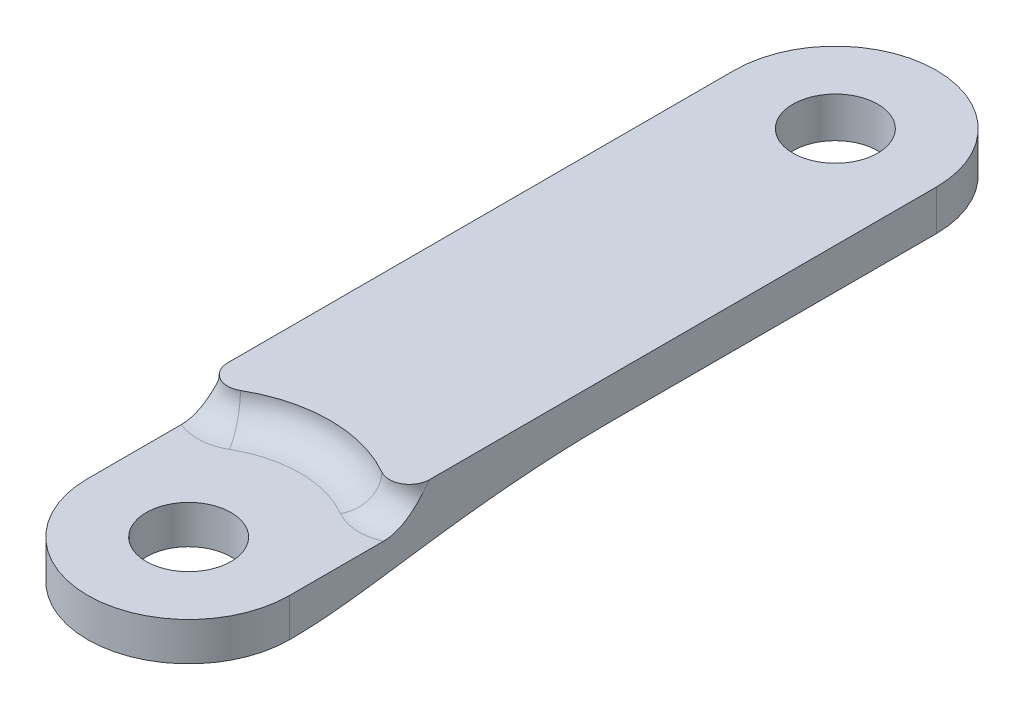
ISO-10303-21;
HEADER;
FILE_DESCRIPTION(('STEP AP214'),'2;1');
FILE_NAME('part.step','',(''),(''),'','','');
FILE_SCHEMA(('AUTOMOTIVE_DESIGN { 1 0 10303 214 1 1 1 1 }'));
ENDSEC;
DATA;
#1=APPLICATION_CONTEXT('core data for automotive mechanical design processes');
#2=APPLICATION_PROTOCOL_DEFINITION('international standard','automotive_design',2000,#1);
#3=PRODUCT_CONTEXT('',#1,'mechanical');
#4=PRODUCT('Part','Part','',(#3));
#5=PRODUCT_RELATED_PRODUCT_CATEGORY('part','',(#4));
#6=PRODUCT_DEFINITION_FORMATION('','',#4);
#7=PRODUCT_DEFINITION_CONTEXT('part definition',#1,'design');
#8=PRODUCT_DEFINITION('design','',#6,#7);
#9=PRODUCT_DEFINITION_SHAPE('','',#8);
#10=(LENGTH_UNIT() NAMED_UNIT(*) SI_UNIT(.MILLI.,.METRE.));
#11=(NAMED_UNIT(*) PLANE_ANGLE_UNIT() SI_UNIT($,.RADIAN.));
#12=(NAMED_UNIT(*) SI_UNIT($,.STERADIAN.) SOLID_ANGLE_UNIT());
#13=UNCERTAINTY_MEASURE_WITH_UNIT(LENGTH_MEASURE(1.E-05),#10,'distance_accuracy_value','');
#14=(GEOMETRIC_REPRESENTATION_CONTEXT(3) GLOBAL_UNCERTAINTY_ASSIGNED_CONTEXT((#13)) GLOBAL_UNIT_ASSIGNED_CONTEXT((#10,
#11,#12)) REPRESENTATION_CONTEXT('',''));
#15=CARTESIAN_POINT('',(0.,0.,0.));
#16=DIRECTION('',(0.,0.,1.));
#17=DIRECTION('',(1.,0.,0.));
#18=AXIS2_PLACEMENT_3D('',#15,#16,#17);
#19=CARTESIAN_POINT('',(0.,-2.,0.));
#20=DIRECTION('',(0.,1.,0.));
#21=DIRECTION('',(0.,0.,1.));
#22=AXIS2_PLACEMENT_3D('',#19,#20,#21);
#23=CYLINDRICAL_SURFACE('',#22,2.1);
#24=CARTESIAN_POINT('',(0.,-1.5,0.));
#25=DIRECTION('',(0.,1.,0.));
#26=DIRECTION('',(0.,0.,1.));
#27=AXIS2_PLACEMENT_3D('',#24,#25,#26);
#28=CIRCLE('',#27,2.1);
#29=CARTESIAN_POINT('',(0.,-1.5,2.1));
#30=VERTEX_POINT('',#29);
#31=EDGE_CURVE('E298',#30,#30,#28,.F.);
#32=ORIENTED_EDGE('',*,*,#31,.F.);
#33=EDGE_LOOP('',(#32));
#34=FACE_BOUND('',#33,.T.);
#35=CARTESIAN_POINT('',(0.,-3.4,0.));
#36=DIRECTION('',(0.,1.,0.));
#37=DIRECTION('',(0.,0.,1.));
#38=AXIS2_PLACEMENT_3D('',#35,#36,#37);
#39=CIRCLE('',#38,2.1);
#40=CARTESIAN_POINT('',(0.,-3.4,2.1));
#41=VERTEX_POINT('',#40);
#42=EDGE_CURVE('E301',#41,#41,#39,.T.);
#43=ORIENTED_EDGE('',*,*,#42,.F.);
#44=EDGE_LOOP('',(#43));
#45=FACE_BOUND('',#44,.T.);
#46=ADVANCED_FACE('F17',(#34,#45),#23,.F.);
#47=CARTESIAN_POINT('',(0.,-3.4,0.));
#48=DIRECTION('',(0.,-1.,0.));
#49=DIRECTION('',(0.,0.,-1.));
#50=AXIS2_PLACEMENT_3D('',#47,#48,#49);
#51=PLANE('',#50);
#52=ORIENTED_EDGE('',*,*,#42,.T.);
#53=EDGE_LOOP('',(#52));
#54=FACE_BOUND('',#53,.T.);
#55=CARTESIAN_POINT('',(0.,-3.4,0.));
#56=DIRECTION('',(0.,1.,0.));
#57=DIRECTION('',(0.,0.,1.));
#58=AXIS2_PLACEMENT_3D('',#55,#56,#57);
#59=CIRCLE('',#58,5.);
#60=CARTESIAN_POINT('',(-5.,-3.4,0.));
#61=VERTEX_POINT('',#60);
#62=CARTESIAN_POINT('',(5.00000000000002,-3.4,0.));
#63=VERTEX_POINT('',#62);
#64=EDGE_CURVE('E294',#61,#63,#59,.T.);
#65=ORIENTED_EDGE('',*,*,#64,.F.);
#66=CARTESIAN_POINT('',(0.,-3.39999999999999,0.));
#67=DIRECTION('',(0.,1.,0.));
#68=DIRECTION('',(0.,0.,1.));
#69=AXIS2_PLACEMENT_3D('',#66,#67,#68);
#70=CIRCLE('',#69,5.00000000000004);
#71=EDGE_CURVE('E109',#61,#63,#70,.F.);
#72=ORIENTED_EDGE('',*,*,#71,.T.);
#73=EDGE_LOOP('',(#65,#72));
#74=FACE_BOUND('',#73,.T.);
#75=ADVANCED_FACE('F306',(#54,#74),#51,.T.);
#76=CARTESIAN_POINT('',(0.,-1.5,0.));
#77=DIRECTION('',(0.,1.,0.));
#78=DIRECTION('',(0.,0.,1.));
#79=AXIS2_PLACEMENT_3D('',#76,#77,#78);
#80=PLANE('',#79);
#81=ORIENTED_EDGE('',*,*,#31,.T.);
#82=EDGE_LOOP('',(#81));
#83=FACE_BOUND('',#82,.T.);
#84=DIRECTION('',(0.,0.,1.));
#85=VECTOR('',#84,1.);
#86=CARTESIAN_POINT('',(-5.,-1.5,-32.));
#87=LINE('',#86,#85);
#88=CARTESIAN_POINT('',(-5.,-1.5,0.));
#89=VERTEX_POINT('',#88);
#90=CARTESIAN_POINT('',(-5.,-1.5,-4.63691538279759));
#91=VERTEX_POINT('',#90);
#92=EDGE_CURVE('E108',#89,#91,#87,.F.);
#93=ORIENTED_EDGE('',*,*,#92,.F.);
#94=CARTESIAN_POINT('',(0.,-1.5,0.));
#95=DIRECTION('',(0.,1.,0.));
#96=DIRECTION('',(0.,0.,1.));
#97=AXIS2_PLACEMENT_3D('',#94,#95,#96);
#98=CIRCLE('',#97,5.);
#99=CARTESIAN_POINT('',(5.,-1.5,0.));
#100=VERTEX_POINT('',#99);
#101=EDGE_CURVE('E72',#100,#89,#98,.F.);
#102=ORIENTED_EDGE('',*,*,#101,.F.);
#103=DIRECTION('',(0.,0.,-1.));
#104=VECTOR('',#103,1.);
#105=CARTESIAN_POINT('',(5.,-1.5,-32.));
#106=LINE('',#105,#104);
#107=CARTESIAN_POINT('',(5.,-1.5,-4.63691538279759));
#108=VERTEX_POINT('',#107);
#109=EDGE_CURVE('E122',#108,#100,#106,.F.);
#110=ORIENTED_EDGE('',*,*,#109,.F.);
#111=CARTESIAN_POINT('',(4.,-1.5,-6.92820323027551));
#112=DIRECTION('',(0.,1.,0.));
#113=DIRECTION('',(-0.500000000000001,0.,0.866025403784438));
#114=AXIS2_PLACEMENT_3D('',#111,#112,#113);
#115=CIRCLE('',#114,2.5);
#116=CARTESIAN_POINT('',(2.75,-1.5,-4.76313972081441));
#117=VERTEX_POINT('',#116);
#118=EDGE_CURVE('E80',#108,#117,#115,.F.);
#119=ORIENTED_EDGE('',*,*,#118,.T.);
#120=CARTESIAN_POINT('',(0.,-1.5,0.));
#121=DIRECTION('',(0.,-1.,0.));
#122=DIRECTION('',(-0.499999999999999,0.,-0.866025403784439));
#123=AXIS2_PLACEMENT_3D('',#120,#121,#122);
#124=CIRCLE('',#123,5.5);
#125=CARTESIAN_POINT('',(-2.75,-1.5,-4.76313972081441));
#126=VERTEX_POINT('',#125);
#127=EDGE_CURVE('E228',#117,#126,#124,.F.);
#128=ORIENTED_EDGE('',*,*,#127,.T.);
#129=CARTESIAN_POINT('',(-4.,-1.5,-6.92820323027551));
#130=DIRECTION('',(0.,1.,0.));
#131=DIRECTION('',(-0.400000000000001,0.,0.916515138991168));
#132=AXIS2_PLACEMENT_3D('',#129,#130,#131);
#133=CIRCLE('',#132,2.5);
#134=EDGE_CURVE('E212',#126,#91,#133,.F.);
#135=ORIENTED_EDGE('',*,*,#134,.T.);
#136=EDGE_LOOP('',(#93,#102,#110,#119,#128,#135));
#137=FACE_BOUND('',#136,.T.);
#138=ADVANCED_FACE('F315',(#83,#137),#80,.T.);
#139=CARTESIAN_POINT('',(0.,-2.,0.));
#140=DIRECTION('',(0.,1.,0.));
#141=DIRECTION('',(0.,0.,1.));
#142=AXIS2_PLACEMENT_3D('',#139,#140,#141);
#143=CYLINDRICAL_SURFACE('',#142,5.);
#144=DIRECTION('',(0.,1.,0.));
#145=VECTOR('',#144,1.);
#146=CARTESIAN_POINT('',(-5.,-2.,0.));
#147=LINE('',#146,#145);
#148=EDGE_CURVE('E227',#61,#89,#147,.T.);
#149=ORIENTED_EDGE('',*,*,#148,.F.);
#150=ORIENTED_EDGE('',*,*,#64,.T.);
#151=DIRECTION('',(0.,1.,0.));
#152=VECTOR('',#151,1.);
#153=CARTESIAN_POINT('',(5.,-2.,0.));
#154=LINE('',#153,#152);
#155=EDGE_CURVE('E120',#100,#63,#154,.F.);
#156=ORIENTED_EDGE('',*,*,#155,.F.);
#157=ORIENTED_EDGE('',*,*,#101,.T.);
#158=EDGE_LOOP('',(#149,#150,#156,#157));
#159=FACE_BOUND('',#158,.T.);
#160=ADVANCED_FACE('F367',(#159),#143,.T.);
#161=CARTESIAN_POINT('',(0.,-52.,16.7490425141796));
#162=DIRECTION('',(1.,0.,0.));
#163=DIRECTION('',(0.,0.,1.));
#164=AXIS2_PLACEMENT_3D('',#161,#162,#163);
#165=CIRCLE('',#164,50.);
#166=TRIMMED_CURVE('',#165,(PARAMETER_VALUE(-1.91238123289034)),
(PARAMETER_VALUE(1.91238123289034)),.T.,.PARAMETER.);
#167=CARTESIAN_POINT('',(0.,-52.,0.));
#168=DIRECTION('',(0.,1.,0.));
#169=AXIS1_PLACEMENT('',#167,#168);
#170=SURFACE_OF_REVOLUTION('',#166,#169);
#171=CARTESIAN_POINT('',(0.,-2.00000000000001,0.));
#172=DIRECTION('',(0.,-1.,0.));
#173=DIRECTION('',(-0.298524527343401,0.,-0.954401962788425));
#174=AXIS2_PLACEMENT_3D('',#171,#172,#173);
#175=CIRCLE('',#174,16.7490425141796);
#176=CARTESIAN_POINT('',(-5.,-2.,-15.9853190503598));
#177=VERTEX_POINT('',#176);
#178=CARTESIAN_POINT('',(5.,-2.,-15.9853190503598));
#179=VERTEX_POINT('',#178);
#180=EDGE_CURVE('E95',#177,#179,#175,.T.);
#181=ORIENTED_EDGE('',*,*,#180,.T.);
#182=CARTESIAN_POINT('',(5.,-3.40000000000001,0.));
#183=CARTESIAN_POINT('',(5.,-3.40003942006319,-0.178369050200472));
#184=CARTESIAN_POINT('',(5.,-3.39769307417243,-0.356730841353404));
#185=CARTESIAN_POINT('',(5.,-3.38852994119652,-0.713080254098323));
#186=CARTESIAN_POINT('',(5.,-3.38171968416566,-0.891068041840519));
#187=CARTESIAN_POINT('',(5.,-3.36393493310426,-1.24669659817037));
#188=CARTESIAN_POINT('',(5.,-3.35296359098955,-1.42433752737546));
#189=CARTESIAN_POINT('',(5.,-3.32737030785973,-1.77931495374137));
#190=CARTESIAN_POINT('',(5.,-3.31274913525035,-1.95665150708041));
#191=CARTESIAN_POINT('',(5.,-3.28043562012542,-2.31108100032337));
#192=CARTESIAN_POINT('',(5.,-3.26274259220794,-2.48817387695021));
#193=CARTESIAN_POINT('',(5.,-3.2248946335996,-2.84214423719565));
#194=CARTESIAN_POINT('',(5.,-3.20473900749244,-3.01902164566005));
#195=CARTESIAN_POINT('',(5.,-3.16255273396521,-3.37260419261243));
#196=CARTESIAN_POINT('',(5.,-3.14052152918045,-3.54930926399716));
#197=CARTESIAN_POINT('',(5.,-3.09511934845129,-3.90258418039522));
#198=CARTESIAN_POINT('',(4.99999999999999,-3.07174808856301,-4.07915398865607));
#199=CARTESIAN_POINT('',(4.99999999999999,-3.00419217934879,-4.58024928773829));
#200=CARTESIAN_POINT('',(5.,-2.95899431126248,-4.90463698342754));
#201=CARTESIAN_POINT('',(5.,-2.86811579988859,-5.55332568659364));
#202=CARTESIAN_POINT('',(5.,-2.82243518132994,-5.87762669764673));
#203=CARTESIAN_POINT('',(5.,-2.73232355826781,-6.52634194119575));
#204=CARTESIAN_POINT('',(5.,-2.68789231854555,-6.8507561405795));
#205=CARTESIAN_POINT('',(5.,-2.60153505277714,-7.49983145148092));
#206=CARTESIAN_POINT('',(5.,-2.55960835424721,-7.82449247279899));
#207=CARTESIAN_POINT('',(5.,-2.47916535900203,-8.47414964997444));
#208=CARTESIAN_POINT('',(5.,-2.44064813577379,-8.79914569035542));
#209=CARTESIAN_POINT('',(5.,-2.36768429677022,-9.44952940275557));
#210=CARTESIAN_POINT('',(5.,-2.33323684928745,-9.77491698098093));
#211=CARTESIAN_POINT('',(5.,-2.26891966343662,-10.4259259985406));
#212=CARTESIAN_POINT('',(5.,-2.23904687221822,-10.7515471349368));
#213=CARTESIAN_POINT('',(5.,-2.18422048099948,-11.4032451353963));
#214=CARTESIAN_POINT('',(5.,-2.15926748517553,-11.7293220504857));
#215=CARTESIAN_POINT('',(5.,-2.11455984592641,-12.3819886964748));
#216=CARTESIAN_POINT('',(5.,-2.09480767264819,-12.7085785972078));
#217=CARTESIAN_POINT('',(5.,-2.06072302578245,-13.3623255149866));
#218=CARTESIAN_POINT('',(5.,-2.04639525764432,-13.6894827782262));
#219=CARTESIAN_POINT('',(5.,-2.02334358975543,-14.34441744177));
#220=CARTESIAN_POINT('',(5.,-2.0146269269449,-14.6721950982569));
#221=CARTESIAN_POINT('',(5.,-2.00294757011961,-15.3284205880492));
#222=CARTESIAN_POINT('',(5.,-1.99999487086714,-15.6568685986052));
#223=CARTESIAN_POINT('',(5.,-2.00000000000001,-15.9853190503598));
#224=B_SPLINE_CURVE_WITH_KNOTS('',3,(#182,#183,#184,#185,#186,#187,#188,#189,#190,#191,#192,
#193,#194,#195,#196,#197,#198,#199,#200,#201,#202,#203,#204,#205,#206,#207,#208,#209,#210,#211,
#212,#213,#214,#215,#216,#217,#218,#219,#220,#221,#222,#223),.UNSPECIFIED.,.F.,.F.,(4,2,2,2,2,2,
2,2,2,2,2,2,2,2,2,2,2,2,2,2,4),(0.,0.535080059911917,1.06937911701512,1.60327426190562,
2.13705709950092,2.67095918980689,3.20501239941305,3.73922487104003,4.27355095812474,
5.25610967971202,6.23861831128177,7.22094071176662,8.2029981563414,9.18478790566465,
10.1663766661525,11.1473074916904,12.1283587056926,13.1098750359559,14.0922408511731,
15.0758711504955,16.0612055634289),.UNSPECIFIED.);
#225=EDGE_CURVE('E101',#63,#179,#224,.T.);
#226=ORIENTED_EDGE('',*,*,#225,.F.);
#227=ORIENTED_EDGE('',*,*,#71,.F.);
#228=CARTESIAN_POINT('',(-4.99999999999999,-2.00000000000001,-15.9853190503598));
#229=CARTESIAN_POINT('',(-5.,-1.99999440212555,-15.6500944734322));
#230=CARTESIAN_POINT('',(-5.,-2.00307038137358,-15.3148725558438));
#231=CARTESIAN_POINT('',(-5.,-2.01523864498065,-14.6448705345488));
#232=CARTESIAN_POINT('',(-5.,-2.02432495166876,-14.3100903226829));
#233=CARTESIAN_POINT('',(-5.,-2.04835948412553,-13.6409672343136));
#234=CARTESIAN_POINT('',(-5.,-2.06330376057321,-13.3066242151155));
#235=CARTESIAN_POINT('',(-5.,-2.09885864842873,-12.6383676370587));
#236=CARTESIAN_POINT('',(-5.,-2.11946711251355,-12.3044539635334));
#237=CARTESIAN_POINT('',(-5.,-2.16610981026203,-11.6370467928646));
#238=CARTESIAN_POINT('',(-5.,-2.19214340432034,-11.3035532508477));
#239=CARTESIAN_POINT('',(-5.,-2.24932900362057,-10.6369571543246));
#240=CARTESIAN_POINT('',(-5.,-2.28048176924261,-10.3038546653176));
#241=CARTESIAN_POINT('',(-5.,-2.34749585256063,-9.63807167296473));
#242=CARTESIAN_POINT('',(-5.,-2.38335792813269,-9.30539124626114));
#243=CARTESIAN_POINT('',(-5.,-2.45924392277814,-8.64043411368373));
#244=CARTESIAN_POINT('',(-5.,-2.49926875364719,-8.30815751245509));
#245=CARTESIAN_POINT('',(-5.,-2.58273276717027,-7.64396615267594));
#246=CARTESIAN_POINT('',(-5.00000000000001,-2.62617265898432,-7.31205148386831));
#247=CARTESIAN_POINT('',(-4.99999999999999,-2.71543874468183,-6.64850889293983));
#248=CARTESIAN_POINT('',(-4.99999999999998,-2.76126520162342,-6.31688100654242));
#249=CARTESIAN_POINT('',(-4.99999999999999,-2.83530859957047,-5.78656388558502));
#250=CARTESIAN_POINT('',(-5.,-2.86322664174233,-5.58783241227706));
#251=CARTESIAN_POINT('',(-5.,-2.9189838653043,-5.1903822990408));
#252=CARTESIAN_POINT('',(-5.,-2.94682305565709,-4.991663660387));
#253=CARTESIAN_POINT('',(-5.,-3.00193255819113,-4.59419097897941));
#254=CARTESIAN_POINT('',(-5.,-3.02920299249721,-4.39543695326341));
#255=CARTESIAN_POINT('',(-5.,-3.0825848432945,-3.99783123869342));
#256=CARTESIAN_POINT('',(-5.,-3.10869659640163,-3.79897959539864));
#257=CARTESIAN_POINT('',(-5.,-3.15906851024159,-3.40110216084634));
#258=CARTESIAN_POINT('',(-5.,-3.1833292418597,-3.20207644258728));
#259=CARTESIAN_POINT('',(-5.,-3.22921489960412,-2.80372324680891));
#260=CARTESIAN_POINT('',(-5.,-3.25083989763655,-2.60439577767201));
#261=CARTESIAN_POINT('',(-5.,-3.29059271807251,-2.20538392273736));
#262=CARTESIAN_POINT('',(-5.,-3.30872048603922,-2.00569953143268));
#263=CARTESIAN_POINT('',(-5.,-3.34061917250226,-1.60588855497913));
#264=CARTESIAN_POINT('',(-5.,-3.35438815315304,-1.40576181287142));
#265=CARTESIAN_POINT('',(-5.,-3.37680156294417,-1.00498458754811));
#266=CARTESIAN_POINT('',(-5.,-3.38544014913428,-0.804333767576046));
#267=CARTESIAN_POINT('',(-5.,-3.39414342056805,-0.503032224356728));
#268=CARTESIAN_POINT('',(-5.,-3.39633546752709,-0.402439997102901));
#269=CARTESIAN_POINT('',(-5.,-3.39926541502932,-0.201232347382193));
#270=CARTESIAN_POINT('',(-5.,-3.40000328540902,-0.100616924477466));
#271=CARTESIAN_POINT('',(-5.,-3.40000000000001,0.));
#272=B_SPLINE_CURVE_WITH_KNOTS('',3,(#228,#229,#230,#231,#232,#233,#234,#235,#236,#237,#238,
#239,#240,#241,#242,#243,#244,#245,#246,#247,#248,#249,#250,#251,#252,#253,#254,#255,#256,#257,
#258,#259,#260,#261,#262,#263,#264,#265,#266,#267,#268,#269,#270,#271),.UNSPECIFIED.,.F.,.F.,(4,
2,2,2,2,2,2,2,2,2,2,2,2,2,2,2,2,2,2,2,2,4),(0.,1.00565562351601,2.01031255637387,
3.01429333219888,4.01789401743202,5.02137644825079,6.02500806706523,7.02880140016814,
8.0328150656321,9.03703777469974,10.0413714090426,10.643420266761,11.2453977008235,
11.8472445174745,12.4489153274399,13.0503998158221,13.6518678912775,14.2533453282464,
14.8550897979163,15.4575182800728,15.7593572491686,16.0612024791394),.UNSPECIFIED.);
#273=EDGE_CURVE('E104',#177,#61,#272,.T.);
#274=ORIENTED_EDGE('',*,*,#273,.F.);
#275=EDGE_LOOP('',(#181,#226,#227,#274));
#276=FACE_BOUND('',#275,.T.);
#277=ADVANCED_FACE('F98',(#276),#170,.T.);
#278=CARTESIAN_POINT('',(0.,-2.,-32.));
#279=DIRECTION('',(0.,1.,0.));
#280=DIRECTION('',(0.,0.,1.));
#281=AXIS2_PLACEMENT_3D('',#278,#279,#280);
#282=PLANE('',#281);
#283=CARTESIAN_POINT('',(0.,-2.,-32.));
#284=DIRECTION('',(0.,1.,0.));
#285=DIRECTION('',(0.,0.,1.));
#286=AXIS2_PLACEMENT_3D('',#283,#284,#285);
#287=CIRCLE('',#286,2.1);
#288=CARTESIAN_POINT('',(0.,-2.,-29.9));
#289=VERTEX_POINT('',#288);
#290=EDGE_CURVE('E249',#289,#289,#287,.T.);
#291=ORIENTED_EDGE('',*,*,#290,.T.);
#292=EDGE_LOOP('',(#291));
#293=FACE_BOUND('',#292,.T.);
#294=ORIENTED_EDGE('',*,*,#180,.F.);
#295=DIRECTION('',(0.,0.,1.));
#296=VECTOR('',#295,1.);
#297=CARTESIAN_POINT('',(-5.,-2.,-32.));
#298=LINE('',#297,#296);
#299=CARTESIAN_POINT('',(-5.,-2.,-32.));
#300=VERTEX_POINT('',#299);
#301=EDGE_CURVE('E261',#300,#177,#298,.T.);
#302=ORIENTED_EDGE('',*,*,#301,.F.);
#303=CARTESIAN_POINT('',(0.,-2.,-32.));
#304=DIRECTION('',(0.,1.,0.));
#305=DIRECTION('',(0.,0.,1.));
#306=AXIS2_PLACEMENT_3D('',#303,#304,#305);
#307=CIRCLE('',#306,5.);
#308=CARTESIAN_POINT('',(5.,-2.,-32.));
#309=VERTEX_POINT('',#308);
#310=EDGE_CURVE('E116',#309,#300,#307,.T.);
#311=ORIENTED_EDGE('',*,*,#310,.F.);
#312=DIRECTION('',(0.,0.,-1.));
#313=VECTOR('',#312,1.);
#314=CARTESIAN_POINT('',(5.,-2.,-32.));
#315=LINE('',#314,#313);
#316=EDGE_CURVE('E113',#179,#309,#315,.T.);
#317=ORIENTED_EDGE('',*,*,#316,.F.);
#318=EDGE_LOOP('',(#294,#302,#311,#317));
#319=FACE_BOUND('',#318,.T.);
#320=ADVANCED_FACE('F114',(#293,#319),#282,.F.);
#321=CARTESIAN_POINT('',(-5.,-2.,-32.));
#322=DIRECTION('',(-1.,0.,0.));
#323=DIRECTION('',(0.,0.,1.));
#324=AXIS2_PLACEMENT_3D('',#321,#322,#323);
#325=PLANE('',#324);
#326=ORIENTED_EDGE('',*,*,#273,.T.);
#327=ORIENTED_EDGE('',*,*,#148,.T.);
#328=ORIENTED_EDGE('',*,*,#92,.T.);
#329=CARTESIAN_POINT('',(-5.,0.,-6.92820323027551));
#330=CARTESIAN_POINT('',(-5.00000303273381,-0.0442721882346948,-6.89216299868919));
#331=CARTESIAN_POINT('',(-5.0000109398592,-0.0885046003528233,-6.85606950528102));
#332=CARTESIAN_POINT('',(-5.00001079194052,-0.166544862340721,-6.79182778747271));
#333=CARTESIAN_POINT('',(-5.00000598274979,-0.200416213098017,-6.76375648234042));
#334=CARTESIAN_POINT('',(-4.99998455070228,-0.247227786001363,-6.72455016628764));
#335=CARTESIAN_POINT('',(-4.99997695853656,-0.260292157772887,-6.71356356437426));
#336=CARTESIAN_POINT('',(-4.99996546226415,-0.292669762833964,-6.6862499164736));
#337=CARTESIAN_POINT('',(-4.99996509459219,-0.311962690801304,-6.66989881931936));
#338=CARTESIAN_POINT('',(-4.99996367738563,-0.36772681981454,-6.622245734366));
#339=CARTESIAN_POINT('',(-4.99996231198045,-0.404023722685396,-6.59073849974672));
#340=CARTESIAN_POINT('',(-4.99994498544795,-0.473451131194086,-6.52921327786515));
#341=CARTESIAN_POINT('',(-4.99993005076672,-0.506625681096773,-6.49924504497002));
#342=CARTESIAN_POINT('',(-4.99993854982767,-0.575154543875684,-6.43597594017041));
#343=CARTESIAN_POINT('',(-4.99996540820383,-0.610449705028923,-6.40261075502423));
#344=CARTESIAN_POINT('',(-5.00003470587416,-0.679571881700467,-6.33527883239502));
#345=CARTESIAN_POINT('',(-5.00007693689519,-0.713412058011957,-6.30132566064808));
#346=CARTESIAN_POINT('',(-5.00013231907946,-0.779445347710784,-6.23270777565063));
#347=CARTESIAN_POINT('',(-5.00014584636946,-0.811654296065063,-6.19805834953692));
#348=CARTESIAN_POINT('',(-5.00013024062649,-0.874263052583672,-6.12802146605328));
#349=CARTESIAN_POINT('',(-5.00010169824933,-0.904681790991086,-6.09265097364068));
#350=CARTESIAN_POINT('',(-5.00003852846062,-0.963565854475929,-6.02121584482786));
#351=CARTESIAN_POINT('',(-5.0000040000841,-0.992053835806417,-5.98516991820231));
#352=CARTESIAN_POINT('',(-4.99999599594888,-1.04742974482416,-5.91180929750523));
#353=CARTESIAN_POINT('',(-5.00002258077209,-1.07431605766516,-5.8744933806066));
#354=CARTESIAN_POINT('',(-5.00007504590002,-1.12660801541344,-5.79800918600399));
#355=CARTESIAN_POINT('',(-5.00010090962296,-1.15198535149993,-5.75882150316785));
#356=CARTESIAN_POINT('',(-5.00012981953336,-1.20093965633662,-5.67855945942711));
#357=CARTESIAN_POINT('',(-5.00013253451253,-1.22448573023639,-5.63746614459829));
#358=CARTESIAN_POINT('',(-5.00011552366627,-1.25808687626488,-5.57464134069913));
#359=CARTESIAN_POINT('',(-5.00010623882642,-1.26905159903745,-5.55339250613653));
#360=CARTESIAN_POINT('',(-5.00008334025806,-1.29039921493913,-5.51043518506406));
#361=CARTESIAN_POINT('',(-5.00006969941996,-1.30077797208908,-5.4887246367716));
#362=CARTESIAN_POINT('',(-5.00004207014041,-1.32090936830947,-5.44485637690488));
#363=CARTESIAN_POINT('',(-5.00002808009764,-1.33065784936581,-5.42269675708399));
#364=CARTESIAN_POINT('',(-5.0000071625249,-1.34948507459399,-5.37794551630494));
#365=CARTESIAN_POINT('',(-5.00000027574377,-1.35855968042933,-5.3553521519633));
#366=CARTESIAN_POINT('',(-4.99999974620213,-1.37525564942296,-5.31168420046836));
#367=CARTESIAN_POINT('',(-5.00000509299869,-1.38293519244005,-5.29063184895857));
#368=CARTESIAN_POINT('',(-5.00001956975493,-1.39772450496247,-5.24800643506879));
#369=CARTESIAN_POINT('',(-5.00002875020133,-1.40482509986407,-5.22643018521657));
#370=CARTESIAN_POINT('',(-5.0000477895981,-1.41840409765627,-5.18276737833531));
#371=CARTESIAN_POINT('',(-5.00005765595362,-1.4248729600631,-5.16067785157638));
#372=CARTESIAN_POINT('',(-5.00007493783632,-1.43713509681182,-5.11600272019173));
#373=CARTESIAN_POINT('',(-5.00008231981678,-1.44291848949469,-5.09341440022046));
#374=CARTESIAN_POINT('',(-5.00009274964794,-1.45375571245487,-5.04776015742478));
#375=CARTESIAN_POINT('',(-5.00009574128676,-1.45879934878832,-5.02469181184289));
#376=CARTESIAN_POINT('',(-5.00009656197187,-1.46810267319567,-4.97810032567011));
#377=CARTESIAN_POINT('',(-5.00009432665438,-1.47235188430372,-4.95457509010372));
#378=CARTESIAN_POINT('',(-5.00008510319622,-1.48001180566739,-4.90709711355045));
#379=CARTESIAN_POINT('',(-5.00007805806307,-1.48341178587553,-4.88314263839954));
#380=CARTESIAN_POINT('',(-5.00006095555195,-1.48931883216493,-4.83483813110559));
#381=CARTESIAN_POINT('',(-5.0000508637779,-1.49181494568182,-4.81048675690715));
#382=CARTESIAN_POINT('',(-5.00003071650012,-1.49586010032822,-4.76142498295446));
#383=CARTESIAN_POINT('',(-5.0000206627283,-1.49739799451527,-4.73671366009478));
#384=CARTESIAN_POINT('',(-5.00000538022278,-1.49947377622958,-4.68697394489149));
#385=CARTESIAN_POINT('',(-5.00000020636961,-1.50000035701828,-4.66194508161179));
#386=CARTESIAN_POINT('',(-5.,-1.5,-4.63691538279759));
#387=B_SPLINE_CURVE_WITH_KNOTS('',3,(#329,#330,#331,#332,#333,#334,#335,#336,#337,#338,#339,
#340,#341,#342,#343,#344,#345,#346,#347,#348,#349,#350,#351,#352,#353,#354,#355,#356,#357,#358,
#359,#360,#361,#362,#363,#364,#365,#366,#367,#368,#369,#370,#371,#372,#373,#374,#375,#376,#377,
#378,#379,#380,#381,#382,#383,#384,#385,#386),.UNSPECIFIED.,.F.,.F.,(4,2,2,2,2,2,2,2,2,2,2,2,2,
2,2,2,2,2,2,2,2,2,2,2,2,2,2,2,4),(0.,0.171265270425441,0.303238968169684,0.354448685595643,
0.430317974748776,0.574501913868732,0.708611942395454,0.85430290509259,0.998089307049783,
1.13997962587821,1.27989669300617,1.41768806565927,1.55561609067629,1.69561601314923,
1.83761572767365,1.90933978056879,1.98151920519424,2.05413436563417,2.1271638144888,
2.19438099310439,2.26251278074049,2.33155150278417,2.40148820082241,2.4723127516314,
2.54401400724054,2.6165799576402,2.68999791744493,2.7642547374829,2.8393370418502),.UNSPECIFIED.);
#388=CARTESIAN_POINT('',(-5.,0.,-6.92820323027551));
#389=VERTEX_POINT('',#388);
#390=EDGE_CURVE('E223',#91,#389,#387,.F.);
#391=ORIENTED_EDGE('',*,*,#390,.T.);
#392=DIRECTION('',(0.,0.,1.));
#393=VECTOR('',#392,1.);
#394=CARTESIAN_POINT('',(-5.,0.,-32.));
#395=LINE('',#394,#393);
#396=CARTESIAN_POINT('',(-5.,0.,-32.));
#397=VERTEX_POINT('',#396);
#398=EDGE_CURVE('E238',#397,#389,#395,.T.);
#399=ORIENTED_EDGE('',*,*,#398,.F.);
#400=DIRECTION('',(0.,1.,0.));
#401=VECTOR('',#400,1.);
#402=CARTESIAN_POINT('',(-5.,-2.,-32.));
#403=LINE('',#402,#401);
#404=EDGE_CURVE('E252',#300,#397,#403,.T.);
#405=ORIENTED_EDGE('',*,*,#404,.F.);
#406=ORIENTED_EDGE('',*,*,#301,.T.);
#407=EDGE_LOOP('',(#326,#327,#328,#391,#399,#405,#406));
#408=FACE_BOUND('',#407,.T.);
#409=ADVANCED_FACE('F235',(#408),#325,.T.);
#410=CARTESIAN_POINT('',(-4.,0.,-6.92820323027551));
#411=DIRECTION('',(0.,1.,0.));
#412=DIRECTION('',(0.,0.,1.));
#413=AXIS2_PLACEMENT_3D('',#410,#411,#412);
#414=TOROIDAL_SURFACE('',#413,2.5,1.5);
#415=ORIENTED_EDGE('',*,*,#134,.F.);
#416=CARTESIAN_POINT('',(-2.75,0.,-4.76313972081441));
#417=DIRECTION('',(-0.866025403784439,0.,0.5));
#418=DIRECTION('',(-0.5,0.,-0.866025403784439));
#419=AXIS2_PLACEMENT_3D('',#416,#417,#418);
#420=CIRCLE('',#419,1.5);
#421=CARTESIAN_POINT('',(-3.5,0.,-6.06217782649107));
#422=VERTEX_POINT('',#421);
#423=EDGE_CURVE('E186',#126,#422,#420,.F.);
#424=ORIENTED_EDGE('',*,*,#423,.T.);
#425=CARTESIAN_POINT('',(-4.,0.,-6.92820323027551));
#426=DIRECTION('',(0.,1.,0.));
#427=DIRECTION('',(0.,0.,1.));
#428=AXIS2_PLACEMENT_3D('',#425,#426,#427);
#429=CIRCLE('',#428,1.);
#430=EDGE_CURVE('E243',#389,#422,#429,.T.);
#431=ORIENTED_EDGE('',*,*,#430,.F.);
#432=ORIENTED_EDGE('',*,*,#390,.F.);
#433=EDGE_LOOP('',(#415,#424,#431,#432));
#434=FACE_BOUND('',#433,.T.);
#435=ADVANCED_FACE('F192',(#434),#414,.F.);
#436=CARTESIAN_POINT('',(0.,0.,0.));
#437=DIRECTION('',(0.,1.,0.));
#438=DIRECTION('',(0.,0.,1.));
#439=AXIS2_PLACEMENT_3D('',#436,#437,#438);
#440=TOROIDAL_SURFACE('',#439,5.5,1.5);
#441=ORIENTED_EDGE('',*,*,#127,.F.);
#442=CARTESIAN_POINT('',(2.75,0.,-4.76313972081441));
#443=DIRECTION('',(0.866025403784438,0.,0.5));
#444=DIRECTION('',(-0.5,0.,0.866025403784438));
#445=AXIS2_PLACEMENT_3D('',#442,#443,#444);
#446=CIRCLE('',#445,1.5);
#447=CARTESIAN_POINT('',(3.5,0.,-6.06217782649107));
#448=VERTEX_POINT('',#447);
#449=EDGE_CURVE('E175',#117,#448,#446,.T.);
#450=ORIENTED_EDGE('',*,*,#449,.T.);
#451=CARTESIAN_POINT('',(0.,0.,0.));
#452=DIRECTION('',(0.,1.,0.));
#453=DIRECTION('',(0.,0.,1.));
#454=AXIS2_PLACEMENT_3D('',#451,#452,#453);
#455=CIRCLE('',#454,7.);
#456=EDGE_CURVE('E230',#422,#448,#455,.F.);
#457=ORIENTED_EDGE('',*,*,#456,.F.);
#458=ORIENTED_EDGE('',*,*,#423,.F.);
#459=EDGE_LOOP('',(#441,#450,#457,#458));
#460=FACE_BOUND('',#459,.T.);
#461=ADVANCED_FACE('F188',(#460),#440,.F.);
#462=CARTESIAN_POINT('',(4.,0.,-6.92820323027551));
#463=DIRECTION('',(0.,1.,0.));
#464=DIRECTION('',(0.,0.,1.));
#465=AXIS2_PLACEMENT_3D('',#462,#463,#464);
#466=TOROIDAL_SURFACE('',#465,2.5,1.5);
#467=CARTESIAN_POINT('',(4.,0.,-6.92820323027551));
#468=DIRECTION('',(0.,1.,0.));
#469=DIRECTION('',(0.,0.,1.));
#470=AXIS2_PLACEMENT_3D('',#467,#468,#469);
#471=CIRCLE('',#470,1.);
#472=CARTESIAN_POINT('',(5.,0.,-6.92820323027551));
#473=VERTEX_POINT('',#472);
#474=EDGE_CURVE('E449',#448,#473,#471,.T.);
#475=ORIENTED_EDGE('',*,*,#474,.F.);
#476=ORIENTED_EDGE('',*,*,#449,.F.);
#477=ORIENTED_EDGE('',*,*,#118,.F.);
#478=CARTESIAN_POINT('',(5.,-1.5,-4.63691538279759));
#479=CARTESIAN_POINT('',(5.00000020647605,-1.50000035780548,-4.66194853223185));
#480=CARTESIAN_POINT('',(5.00000529923798,-1.49947363115938,-4.68698084591429));
#481=CARTESIAN_POINT('',(5.00002030885838,-1.49739730154509,-4.73672667979083));
#482=CARTESIAN_POINT('',(5.00003017191994,-1.49585903818196,-4.76144067235717));
#483=CARTESIAN_POINT('',(5.00004987933496,-1.49181298811229,-4.81050700325428));
#484=CARTESIAN_POINT('',(5.00005972263508,-1.48931637961983,-4.83486026739936));
#485=CARTESIAN_POINT('',(5.00007632008158,-1.48340828359698,-4.88316778158761));
#486=CARTESIAN_POINT('',(5.00008310883633,-1.48000777817422,-4.90712337746335));
#487=CARTESIAN_POINT('',(5.00009185887646,-1.47234683989981,-4.95460284079802));
#488=CARTESIAN_POINT('',(5.00009387686108,-1.46809716483352,-4.97812844708281));
#489=CARTESIAN_POINT('',(5.00009270620651,-1.45879303544815,-5.02471994654198));
#490=CARTESIAN_POINT('',(5.00008958108289,-1.45374908395657,-5.04778794004683));
#491=CARTESIAN_POINT('',(5.00007900772813,-1.44291143775967,-5.09344078410166));
#492=CARTESIAN_POINT('',(5.00007161431542,-1.43712796094322,-5.11602806327241));
#493=CARTESIAN_POINT('',(5.00005447994997,-1.42486594475415,-5.1607004593619));
#494=CARTESIAN_POINT('',(5.00004477043532,-1.41839730900382,-5.18278829780219));
#495=CARTESIAN_POINT('',(5.00002621454756,-1.40481912072155,-5.22644711756817));
#496=CARTESIAN_POINT('',(5.00001735849269,-1.39771912875429,-5.24802107497365));
#497=CARTESIAN_POINT('',(5.00000385478466,-1.38293147399445,-5.29064135333216));
#498=CARTESIAN_POINT('',(4.99999915211134,-1.37525300355541,-5.31169086795667));
#499=CARTESIAN_POINT('',(5.00000092156379,-1.35855608846649,-5.3553618212482));
#500=CARTESIAN_POINT('',(5.00000840020196,-1.3494791849134,-5.37796091811459));
#501=CARTESIAN_POINT('',(5.00003001288238,-1.33064746110394,-5.42272211325413));
#502=CARTESIAN_POINT('',(5.00004410854377,-1.32089682331306,-5.44488597353116));
#503=CARTESIAN_POINT('',(5.00007171259225,-1.30076137797877,-5.48876128650629));
#504=CARTESIAN_POINT('',(5.00008522401937,-1.29038076940304,-5.51047466632495));
#505=CARTESIAN_POINT('',(5.00010769464627,-1.26902983693003,-5.55343629937024));
#506=CARTESIAN_POINT('',(5.0001166822724,-1.25806368692762,-5.57468663339758));
#507=CARTESIAN_POINT('',(5.00013274407394,-1.22445997066807,-5.63751232640408));
#508=CARTESIAN_POINT('',(5.00012931834229,-1.20091279173045,-5.67860502144726));
#509=CARTESIAN_POINT('',(5.00009923947374,-1.15195899084852,-5.75886146004273));
#510=CARTESIAN_POINT('',(5.00007291662092,-1.12658349548936,-5.79804430106761));
#511=CARTESIAN_POINT('',(5.00002106521778,-1.07429910614381,-5.87451564017014));
#512=CARTESIAN_POINT('',(4.99999553067625,-1.04741870126142,-5.91182366746636));
#513=CARTESIAN_POINT('',(5.00000447061429,-0.992019443521805,-5.98521573863191));
#514=CARTESIAN_POINT('',(5.00003896242391,-0.963500119795857,-6.02129942595921));
#515=CARTESIAN_POINT('',(5.00010006861985,-0.904557303675132,-6.09279649284481));
#516=CARTESIAN_POINT('',(5.0001265559143,-0.874111528515436,-6.12819146836811));
#517=CARTESIAN_POINT('',(5.0001383253811,-0.811454815797281,-6.19826613482098));
#518=CARTESIAN_POINT('',(5.00012303257943,-0.779225288470665,-6.23292916175059));
#519=CARTESIAN_POINT('',(5.00006510712688,-0.713158322825833,-6.30156514998101));
#520=CARTESIAN_POINT('',(5.00002211860543,-0.679305342068108,-6.33552310254758));
#521=CARTESIAN_POINT('',(4.99995308252729,-0.6101666789116,-6.402858133151));
#522=CARTESIAN_POINT('',(4.99992726274011,-0.574868084233675,-6.43622189887745));
#523=CARTESIAN_POINT('',(4.99992116158537,-0.50632810062613,-6.49949490808646));
#524=CARTESIAN_POINT('',(4.99993743023442,-0.473145648788512,-6.52946823629042));
#525=CARTESIAN_POINT('',(4.9999571331003,-0.403706007905777,-6.59100051323217));
#526=CARTESIAN_POINT('',(4.99995951329209,-0.367404856325476,-6.62250979659678));
#527=CARTESIAN_POINT('',(4.99996247313677,-0.311636466117705,-6.67016584145601));
#528=CARTESIAN_POINT('',(4.99996337154627,-0.292343128185068,-6.68651738758158));
#529=CARTESIAN_POINT('',(4.99997556964186,-0.2599846015515,-6.7138151613423));
#530=CARTESIAN_POINT('',(4.99998338250101,-0.246939762208896,-6.72478549164223));
#531=CARTESIAN_POINT('',(5.00000546889168,-0.200190099366712,-6.76394048307879));
#532=CARTESIAN_POINT('',(5.00001048743117,-0.166361221587912,-6.7919768510528));
#533=CARTESIAN_POINT('',(5.00001087145564,-0.0884104222985358,-6.85614550788348));
#534=CARTESIAN_POINT('',(5.00000291504438,-0.0442250165453646,-6.89220089865713));
#535=CARTESIAN_POINT('',(5.,0.,-6.92820323027551));
#536=B_SPLINE_CURVE_WITH_KNOTS('',3,(#478,#479,#480,#481,#482,#483,#484,#485,#486,#487,#488,
#489,#490,#491,#492,#493,#494,#495,#496,#497,#498,#499,#500,#501,#502,#503,#504,#505,#506,#507,
#508,#509,#510,#511,#512,#513,#514,#515,#516,#517,#518,#519,#520,#521,#522,#523,#524,#525,#526,
#527,#528,#529,#530,#531,#532,#533,#534,#535),.UNSPECIFIED.,.F.,.F.,(4,2,2,2,2,2,2,2,2,2,2,2,2,
2,2,2,2,2,2,2,2,2,2,2,2,2,2,2,4),(0.,0.075092653506594,0.149357528853004,0.222781275273166,
0.295350772920775,0.36705336948614,0.437877091366652,0.507810829935594,0.576844503885518,
0.644969198962327,0.712177286662794,0.785225250618061,0.857854651447197,0.930044128522541,
1.00177413908611,1.14377387877607,1.28375865784681,1.42165718373582,1.55959552850975,
1.69962104580292,1.84158325285568,1.98540697211217,2.13110256523993,2.26524044022059,
2.4094380539642,2.48530915491034,2.53644260733106,2.66825131952118,2.83933506253858),.UNSPECIFIED.);
#537=EDGE_CURVE('E166',#473,#108,#536,.F.);
#538=ORIENTED_EDGE('',*,*,#537,.F.);
#539=EDGE_LOOP('',(#475,#476,#477,#538));
#540=FACE_BOUND('',#539,.T.);
#541=ADVANCED_FACE('F145',(#540),#466,.F.);
#542=CARTESIAN_POINT('',(5.,-2.,-32.));
#543=DIRECTION('',(1.,0.,0.));
#544=DIRECTION('',(0.,0.,-1.));
#545=AXIS2_PLACEMENT_3D('',#542,#543,#544);
#546=PLANE('',#545);
#547=ORIENTED_EDGE('',*,*,#316,.T.);
#548=DIRECTION('',(0.,1.,0.));
#549=VECTOR('',#548,1.);
#550=CARTESIAN_POINT('',(5.,-2.,-32.));
#551=LINE('',#550,#549);
#552=CARTESIAN_POINT('',(5.,0.,-32.));
#553=VERTEX_POINT('',#552);
#554=EDGE_CURVE('E35',#553,#309,#551,.F.);
#555=ORIENTED_EDGE('',*,*,#554,.F.);
#556=DIRECTION('',(0.,0.,1.));
#557=VECTOR('',#556,1.);
#558=CARTESIAN_POINT('',(5.,0.,-32.));
#559=LINE('',#558,#557);
#560=EDGE_CURVE('E447',#473,#553,#559,.F.);
#561=ORIENTED_EDGE('',*,*,#560,.F.);
#562=ORIENTED_EDGE('',*,*,#537,.T.);
#563=ORIENTED_EDGE('',*,*,#109,.T.);
#564=ORIENTED_EDGE('',*,*,#155,.T.);
#565=ORIENTED_EDGE('',*,*,#225,.T.);
#566=EDGE_LOOP('',(#547,#555,#561,#562,#563,#564,#565));
#567=FACE_BOUND('',#566,.T.);
#568=ADVANCED_FACE('F118',(#567),#546,.T.);
#569=CARTESIAN_POINT('',(0.,-2.,-32.));
#570=DIRECTION('',(0.,1.,0.));
#571=DIRECTION('',(0.,0.,1.));
#572=AXIS2_PLACEMENT_3D('',#569,#570,#571);
#573=CYLINDRICAL_SURFACE('',#572,5.);
#574=ORIENTED_EDGE('',*,*,#310,.T.);
#575=ORIENTED_EDGE('',*,*,#404,.T.);
#576=CARTESIAN_POINT('',(0.,0.,-32.));
#577=DIRECTION('',(0.,1.,0.));
#578=DIRECTION('',(0.,0.,1.));
#579=AXIS2_PLACEMENT_3D('',#576,#577,#578);
#580=CIRCLE('',#579,5.);
#581=EDGE_CURVE('E26',#553,#397,#580,.T.);
#582=ORIENTED_EDGE('',*,*,#581,.F.);
#583=ORIENTED_EDGE('',*,*,#554,.T.);
#584=EDGE_LOOP('',(#574,#575,#582,#583));
#585=FACE_BOUND('',#584,.T.);
#586=ADVANCED_FACE('F144',(#585),#573,.T.);
#587=CARTESIAN_POINT('',(0.,-2.,-32.));
#588=DIRECTION('',(0.,1.,0.));
#589=DIRECTION('',(0.,0.,1.));
#590=AXIS2_PLACEMENT_3D('',#587,#588,#589);
#591=CYLINDRICAL_SURFACE('',#590,2.1);
#592=CARTESIAN_POINT('',(0.,0.,-32.));
#593=DIRECTION('',(0.,1.,0.));
#594=DIRECTION('',(0.,0.,1.));
#595=AXIS2_PLACEMENT_3D('',#592,#593,#594);
#596=CIRCLE('',#595,2.1);
#597=CARTESIAN_POINT('',(0.,0.,-29.9));
#598=VERTEX_POINT('',#597);
#599=EDGE_CURVE('E11',#598,#598,#596,.F.);
#600=ORIENTED_EDGE('',*,*,#599,.F.);
#601=EDGE_LOOP('',(#600));
#602=FACE_BOUND('',#601,.T.);
#603=ORIENTED_EDGE('',*,*,#290,.F.);
#604=EDGE_LOOP('',(#603));
#605=FACE_BOUND('',#604,.T.);
#606=ADVANCED_FACE('F318',(#602,#605),#591,.F.);
#607=CARTESIAN_POINT('',(0.,0.,-32.));
#608=DIRECTION('',(0.,1.,0.));
#609=DIRECTION('',(0.,0.,1.));
#610=AXIS2_PLACEMENT_3D('',#607,#608,#609);
#611=PLANE('',#610);
#612=ORIENTED_EDGE('',*,*,#599,.T.);
#613=EDGE_LOOP('',(#612));
#614=FACE_BOUND('',#613,.T.);
#615=ORIENTED_EDGE('',*,*,#560,.T.);
#616=ORIENTED_EDGE('',*,*,#581,.T.);
#617=ORIENTED_EDGE('',*,*,#398,.T.);
#618=ORIENTED_EDGE('',*,*,#430,.T.);
#619=ORIENTED_EDGE('',*,*,#456,.T.);
#620=ORIENTED_EDGE('',*,*,#474,.T.);
#621=EDGE_LOOP('',(#615,#616,#617,#618,#619,#620));
#622=FACE_BOUND('',#621,.T.);
#623=ADVANCED_FACE('F248',(#614,#622),#611,.T.);
#624=CLOSED_SHELL('',(#46,#75,#138,#160,#277,#320,#409,#435,#461,#541,#568,#586,#606,#623));
#625=MANIFOLD_SOLID_BREP('B1',#624);
#626=ADVANCED_BREP_SHAPE_REPRESENTATION('',(#18,#625),#14);
#627=SHAPE_DEFINITION_REPRESENTATION(#9,#626);
ENDSEC;
END-ISO-10303-21;
